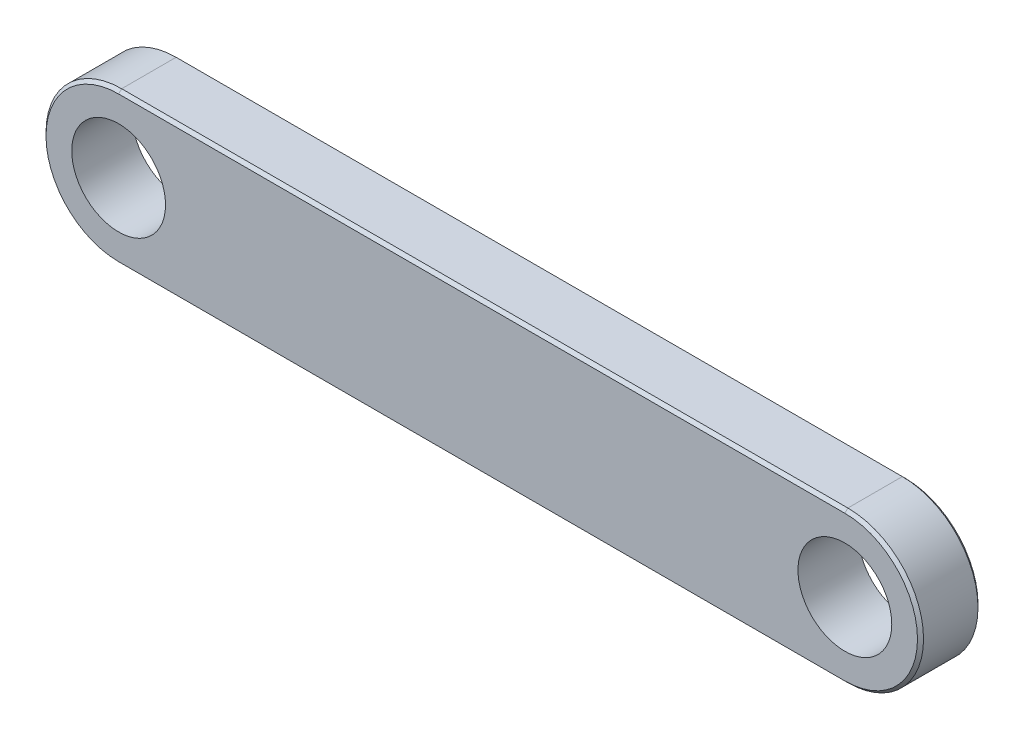
ISO-10303-21;
HEADER;
FILE_DESCRIPTION(('STEP AP214'),'2;1');
FILE_NAME('part.step','',(''),(''),'','','');
FILE_SCHEMA(('AUTOMOTIVE_DESIGN { 1 0 10303 214 1 1 1 1 }'));
ENDSEC;
DATA;
#1=APPLICATION_CONTEXT('core data for automotive mechanical design processes');
#2=APPLICATION_PROTOCOL_DEFINITION('international standard','automotive_design',2000,#1);
#3=PRODUCT_CONTEXT('',#1,'mechanical');
#4=PRODUCT('Part','Part','',(#3));
#5=PRODUCT_RELATED_PRODUCT_CATEGORY('part','',(#4));
#6=PRODUCT_DEFINITION_FORMATION('','',#4);
#7=PRODUCT_DEFINITION_CONTEXT('part definition',#1,'design');
#8=PRODUCT_DEFINITION('design','',#6,#7);
#9=PRODUCT_DEFINITION_SHAPE('','',#8);
#10=(LENGTH_UNIT() NAMED_UNIT(*) SI_UNIT(.MILLI.,.METRE.));
#11=(NAMED_UNIT(*) PLANE_ANGLE_UNIT() SI_UNIT($,.RADIAN.));
#12=(NAMED_UNIT(*) SI_UNIT($,.STERADIAN.) SOLID_ANGLE_UNIT());
#13=UNCERTAINTY_MEASURE_WITH_UNIT(LENGTH_MEASURE(1.E-05),#10,'distance_accuracy_value','');
#14=(GEOMETRIC_REPRESENTATION_CONTEXT(3) GLOBAL_UNCERTAINTY_ASSIGNED_CONTEXT((#13)) GLOBAL_UNIT_ASSIGNED_CONTEXT((#10,
#11,#12)) REPRESENTATION_CONTEXT('',''));
#15=CARTESIAN_POINT('',(0.,0.,0.));
#16=DIRECTION('',(0.,0.,1.));
#17=DIRECTION('',(1.,0.,0.));
#18=AXIS2_PLACEMENT_3D('',#15,#16,#17);
#19=CARTESIAN_POINT('',(-11.9297449390968,0.,2.));
#20=DIRECTION('',(0.,0.,1.));
#21=DIRECTION('',(1.,0.,0.));
#22=AXIS2_PLACEMENT_3D('',#19,#20,#21);
#23=PLANE('',#22);
#24=CARTESIAN_POINT('',(-11.9297449390968,0.,2.));
#25=DIRECTION('',(0.,0.,1.));
#26=DIRECTION('',(1.,0.,0.));
#27=AXIS2_PLACEMENT_3D('',#24,#25,#26);
#28=CIRCLE('',#27,2.4);
#29=CARTESIAN_POINT('',(-11.9297449390968,2.4,2.));
#30=VERTEX_POINT('',#29);
#31=CARTESIAN_POINT('',(-11.9297449390968,-2.4,2.));
#32=VERTEX_POINT('',#31);
#33=EDGE_CURVE('E60',#30,#32,#28,.T.);
#34=ORIENTED_EDGE('',*,*,#33,.T.);
#35=DIRECTION('',(1.,0.,0.));
#36=VECTOR('',#35,1.);
#37=CARTESIAN_POINT('',(12.0702550609032,-2.4,2.));
#38=LINE('',#37,#36);
#39=CARTESIAN_POINT('',(12.0702550609032,-2.4,2.));
#40=VERTEX_POINT('',#39);
#41=EDGE_CURVE('E11',#32,#40,#38,.T.);
#42=ORIENTED_EDGE('',*,*,#41,.T.);
#43=CARTESIAN_POINT('',(12.0702550609032,0.,2.));
#44=DIRECTION('',(0.,0.,1.));
#45=DIRECTION('',(1.,0.,0.));
#46=AXIS2_PLACEMENT_3D('',#43,#44,#45);
#47=CIRCLE('',#46,2.4);
#48=CARTESIAN_POINT('',(12.0702550609032,2.4,2.));
#49=VERTEX_POINT('',#48);
#50=EDGE_CURVE('E45',#40,#49,#47,.T.);
#51=ORIENTED_EDGE('',*,*,#50,.T.);
#52=DIRECTION('',(-1.,0.,0.));
#53=VECTOR('',#52,1.);
#54=CARTESIAN_POINT('',(-11.9297449390968,2.4,2.));
#55=LINE('',#54,#53);
#56=EDGE_CURVE('E200',#49,#30,#55,.T.);
#57=ORIENTED_EDGE('',*,*,#56,.T.);
#58=EDGE_LOOP('',(#34,#42,#51,#57));
#59=FACE_BOUND('',#58,.T.);
#60=CARTESIAN_POINT('',(12.0702550609032,0.,2.));
#61=DIRECTION('',(0.,0.,1.));
#62=DIRECTION('',(1.,0.,0.));
#63=AXIS2_PLACEMENT_3D('',#60,#61,#62);
#64=CIRCLE('',#63,1.55);
#65=CARTESIAN_POINT('',(13.6202550609032,0.,2.));
#66=VERTEX_POINT('',#65);
#67=EDGE_CURVE('E172',#66,#66,#64,.T.);
#68=ORIENTED_EDGE('',*,*,#67,.F.);
#69=EDGE_LOOP('',(#68));
#70=FACE_BOUND('',#69,.T.);
#71=CARTESIAN_POINT('',(-11.9297449390968,0.,2.));
#72=DIRECTION('',(0.,0.,1.));
#73=DIRECTION('',(1.,0.,0.));
#74=AXIS2_PLACEMENT_3D('',#71,#72,#73);
#75=CIRCLE('',#74,1.55);
#76=CARTESIAN_POINT('',(-10.3797449390968,0.,2.));
#77=VERTEX_POINT('',#76);
#78=EDGE_CURVE('E164',#77,#77,#75,.T.);
#79=ORIENTED_EDGE('',*,*,#78,.F.);
#80=EDGE_LOOP('',(#79));
#81=FACE_BOUND('',#80,.T.);
#82=ADVANCED_FACE('F35',(#59,#70,#81),#23,.T.);
#83=CARTESIAN_POINT('',(-11.9297449390968,0.,0.));
#84=DIRECTION('',(0.,0.,1.));
#85=DIRECTION('',(1.,0.,0.));
#86=AXIS2_PLACEMENT_3D('',#83,#84,#85);
#87=PLANE('',#86);
#88=CARTESIAN_POINT('',(12.0702550609032,0.,0.));
#89=DIRECTION('',(0.,0.,1.));
#90=DIRECTION('',(1.,0.,0.));
#91=AXIS2_PLACEMENT_3D('',#88,#89,#90);
#92=CIRCLE('',#91,2.4);
#93=CARTESIAN_POINT('',(12.0702550609032,2.4,0.));
#94=VERTEX_POINT('',#93);
#95=CARTESIAN_POINT('',(12.0702550609032,-2.4,0.));
#96=VERTEX_POINT('',#95);
#97=EDGE_CURVE('E187',#94,#96,#92,.F.);
#98=ORIENTED_EDGE('',*,*,#97,.T.);
#99=DIRECTION('',(-1.,0.,0.));
#100=VECTOR('',#99,1.);
#101=CARTESIAN_POINT('',(-11.9297449390968,-2.4,0.));
#102=LINE('',#101,#100);
#103=CARTESIAN_POINT('',(-11.9297449390968,-2.4,0.));
#104=VERTEX_POINT('',#103);
#105=EDGE_CURVE('E116',#96,#104,#102,.T.);
#106=ORIENTED_EDGE('',*,*,#105,.T.);
#107=CARTESIAN_POINT('',(-11.9297449390968,0.,0.));
#108=DIRECTION('',(0.,0.,1.));
#109=DIRECTION('',(1.,0.,0.));
#110=AXIS2_PLACEMENT_3D('',#107,#108,#109);
#111=CIRCLE('',#110,2.4);
#112=CARTESIAN_POINT('',(-11.9297449390968,2.4,0.));
#113=VERTEX_POINT('',#112);
#114=EDGE_CURVE('E185',#104,#113,#111,.F.);
#115=ORIENTED_EDGE('',*,*,#114,.T.);
#116=DIRECTION('',(1.,0.,0.));
#117=VECTOR('',#116,1.);
#118=CARTESIAN_POINT('',(-11.9297449390968,2.4,0.));
#119=LINE('',#118,#117);
#120=EDGE_CURVE('E183',#113,#94,#119,.T.);
#121=ORIENTED_EDGE('',*,*,#120,.T.);
#122=EDGE_LOOP('',(#98,#106,#115,#121));
#123=FACE_BOUND('',#122,.T.);
#124=CARTESIAN_POINT('',(12.0702550609032,0.,0.));
#125=DIRECTION('',(0.,0.,1.));
#126=DIRECTION('',(1.,0.,0.));
#127=AXIS2_PLACEMENT_3D('',#124,#125,#126);
#128=CIRCLE('',#127,1.55);
#129=CARTESIAN_POINT('',(13.6202550609032,0.,0.));
#130=VERTEX_POINT('',#129);
#131=EDGE_CURVE('E169',#130,#130,#128,.T.);
#132=ORIENTED_EDGE('',*,*,#131,.T.);
#133=EDGE_LOOP('',(#132));
#134=FACE_BOUND('',#133,.T.);
#135=CARTESIAN_POINT('',(-11.9297449390968,0.,0.));
#136=DIRECTION('',(0.,0.,1.));
#137=DIRECTION('',(1.,0.,0.));
#138=AXIS2_PLACEMENT_3D('',#135,#136,#137);
#139=CIRCLE('',#138,1.55);
#140=CARTESIAN_POINT('',(-10.3797449390968,0.,0.));
#141=VERTEX_POINT('',#140);
#142=EDGE_CURVE('E158',#141,#141,#139,.T.);
#143=ORIENTED_EDGE('',*,*,#142,.T.);
#144=EDGE_LOOP('',(#143));
#145=FACE_BOUND('',#144,.T.);
#146=ADVANCED_FACE('F230',(#123,#134,#145),#87,.F.);
#147=CARTESIAN_POINT('',(-11.9297449390968,0.,2.));
#148=DIRECTION('',(0.,0.,-1.));
#149=DIRECTION('',(-1.,0.,0.));
#150=AXIS2_PLACEMENT_3D('',#147,#148,#149);
#151=CYLINDRICAL_SURFACE('',#150,2.5);
#152=DIRECTION('',(0.,0.,-1.));
#153=VECTOR('',#152,1.);
#154=CARTESIAN_POINT('',(-11.9297449390968,2.5,2.));
#155=LINE('',#154,#153);
#156=CARTESIAN_POINT('',(-11.9297449390968,2.5,1.9));
#157=VERTEX_POINT('',#156);
#158=CARTESIAN_POINT('',(-11.9297449390968,2.5,0.0999999999999994));
#159=VERTEX_POINT('',#158);
#160=EDGE_CURVE('E175',#157,#159,#155,.T.);
#161=ORIENTED_EDGE('',*,*,#160,.T.);
#162=CARTESIAN_POINT('',(-11.9297449390968,0.,0.0999999999999994));
#163=DIRECTION('',(0.,0.,1.));
#164=DIRECTION('',(1.,0.,0.));
#165=AXIS2_PLACEMENT_3D('',#162,#163,#164);
#166=CIRCLE('',#165,2.5);
#167=CARTESIAN_POINT('',(-11.9297449390968,-2.5,0.0999999999999994));
#168=VERTEX_POINT('',#167);
#169=EDGE_CURVE('E194',#159,#168,#166,.T.);
#170=ORIENTED_EDGE('',*,*,#169,.T.);
#171=DIRECTION('',(0.,0.,-1.));
#172=VECTOR('',#171,1.);
#173=CARTESIAN_POINT('',(-11.9297449390968,-2.5,2.));
#174=LINE('',#173,#172);
#175=CARTESIAN_POINT('',(-11.9297449390968,-2.5,1.9));
#176=VERTEX_POINT('',#175);
#177=EDGE_CURVE('E127',#176,#168,#174,.T.);
#178=ORIENTED_EDGE('',*,*,#177,.F.);
#179=CARTESIAN_POINT('',(-11.9297449390968,0.,1.9));
#180=DIRECTION('',(0.,0.,1.));
#181=DIRECTION('',(1.,0.,0.));
#182=AXIS2_PLACEMENT_3D('',#179,#180,#181);
#183=CIRCLE('',#182,2.5);
#184=EDGE_CURVE('E192',#176,#157,#183,.F.);
#185=ORIENTED_EDGE('',*,*,#184,.T.);
#186=EDGE_LOOP('',(#161,#170,#178,#185));
#187=FACE_BOUND('',#186,.T.);
#188=ADVANCED_FACE('F209',(#187),#151,.T.);
#189=CARTESIAN_POINT('',(-11.9297449390968,-2.5,2.));
#190=DIRECTION('',(0.,1.,0.));
#191=DIRECTION('',(0.,0.,1.));
#192=AXIS2_PLACEMENT_3D('',#189,#190,#191);
#193=PLANE('',#192);
#194=ORIENTED_EDGE('',*,*,#177,.T.);
#195=DIRECTION('',(1.,0.,0.));
#196=VECTOR('',#195,1.);
#197=CARTESIAN_POINT('',(-11.9297449390968,-2.5,0.0999999999999994));
#198=LINE('',#197,#196);
#199=CARTESIAN_POINT('',(12.0702550609032,-2.5,0.0999999999999994));
#200=VERTEX_POINT('',#199);
#201=EDGE_CURVE('E126',#168,#200,#198,.T.);
#202=ORIENTED_EDGE('',*,*,#201,.T.);
#203=DIRECTION('',(0.,0.,-1.));
#204=VECTOR('',#203,1.);
#205=CARTESIAN_POINT('',(12.0702550609032,-2.5,2.));
#206=LINE('',#205,#204);
#207=CARTESIAN_POINT('',(12.0702550609032,-2.5,1.9));
#208=VERTEX_POINT('',#207);
#209=EDGE_CURVE('E109',#208,#200,#206,.T.);
#210=ORIENTED_EDGE('',*,*,#209,.F.);
#211=DIRECTION('',(-1.,0.,0.));
#212=VECTOR('',#211,1.);
#213=CARTESIAN_POINT('',(-11.9297449390968,-2.5,1.9));
#214=LINE('',#213,#212);
#215=EDGE_CURVE('E123',#208,#176,#214,.T.);
#216=ORIENTED_EDGE('',*,*,#215,.T.);
#217=EDGE_LOOP('',(#194,#202,#210,#216));
#218=FACE_BOUND('',#217,.T.);
#219=ADVANCED_FACE('F122',(#218),#193,.F.);
#220=CARTESIAN_POINT('',(12.0702550609032,0.,2.));
#221=DIRECTION('',(0.,0.,-1.));
#222=DIRECTION('',(-1.,0.,0.));
#223=AXIS2_PLACEMENT_3D('',#220,#221,#222);
#224=CYLINDRICAL_SURFACE('',#223,2.5);
#225=ORIENTED_EDGE('',*,*,#209,.T.);
#226=CARTESIAN_POINT('',(12.0702550609032,0.,0.0999999999999994));
#227=DIRECTION('',(0.,0.,1.));
#228=DIRECTION('',(1.,0.,0.));
#229=AXIS2_PLACEMENT_3D('',#226,#227,#228);
#230=CIRCLE('',#229,2.5);
#231=CARTESIAN_POINT('',(12.0702550609032,2.5,0.0999999999999994));
#232=VERTEX_POINT('',#231);
#233=EDGE_CURVE('E115',#200,#232,#230,.T.);
#234=ORIENTED_EDGE('',*,*,#233,.T.);
#235=DIRECTION('',(0.,0.,-1.));
#236=VECTOR('',#235,1.);
#237=CARTESIAN_POINT('',(12.0702550609032,2.5,2.));
#238=LINE('',#237,#236);
#239=CARTESIAN_POINT('',(12.0702550609032,2.5,1.9));
#240=VERTEX_POINT('',#239);
#241=EDGE_CURVE('E111',#240,#232,#238,.T.);
#242=ORIENTED_EDGE('',*,*,#241,.F.);
#243=CARTESIAN_POINT('',(12.0702550609032,0.,1.9));
#244=DIRECTION('',(0.,0.,1.));
#245=DIRECTION('',(1.,0.,0.));
#246=AXIS2_PLACEMENT_3D('',#243,#244,#245);
#247=CIRCLE('',#246,2.5);
#248=EDGE_CURVE('E106',#240,#208,#247,.F.);
#249=ORIENTED_EDGE('',*,*,#248,.T.);
#250=EDGE_LOOP('',(#225,#234,#242,#249));
#251=FACE_BOUND('',#250,.T.);
#252=ADVANCED_FACE('F108',(#251),#224,.T.);
#253=CARTESIAN_POINT('',(-11.9297449390968,2.5,2.));
#254=DIRECTION('',(0.,-1.,0.));
#255=DIRECTION('',(0.,0.,-1.));
#256=AXIS2_PLACEMENT_3D('',#253,#254,#255);
#257=PLANE('',#256);
#258=ORIENTED_EDGE('',*,*,#241,.T.);
#259=DIRECTION('',(-1.,0.,0.));
#260=VECTOR('',#259,1.);
#261=CARTESIAN_POINT('',(-11.9297449390968,2.5,0.0999999999999994));
#262=LINE('',#261,#260);
#263=EDGE_CURVE('E198',#232,#159,#262,.T.);
#264=ORIENTED_EDGE('',*,*,#263,.T.);
#265=ORIENTED_EDGE('',*,*,#160,.F.);
#266=DIRECTION('',(1.,0.,0.));
#267=VECTOR('',#266,1.);
#268=CARTESIAN_POINT('',(12.0702550609032,2.5,1.9));
#269=LINE('',#268,#267);
#270=EDGE_CURVE('E196',#157,#240,#269,.T.);
#271=ORIENTED_EDGE('',*,*,#270,.T.);
#272=EDGE_LOOP('',(#258,#264,#265,#271));
#273=FACE_BOUND('',#272,.T.);
#274=ADVANCED_FACE('F211',(#273),#257,.F.);
#275=CARTESIAN_POINT('',(12.0702550609032,0.,2.));
#276=DIRECTION('',(0.,0.,-1.));
#277=DIRECTION('',(-1.,0.,0.));
#278=AXIS2_PLACEMENT_3D('',#275,#276,#277);
#279=CYLINDRICAL_SURFACE('',#278,1.55);
#280=ORIENTED_EDGE('',*,*,#67,.T.);
#281=EDGE_LOOP('',(#280));
#282=FACE_BOUND('',#281,.T.);
#283=ORIENTED_EDGE('',*,*,#131,.F.);
#284=EDGE_LOOP('',(#283));
#285=FACE_BOUND('',#284,.T.);
#286=ADVANCED_FACE('F238',(#282,#285),#279,.F.);
#287=CARTESIAN_POINT('',(-11.9297449390968,0.,2.));
#288=DIRECTION('',(0.,0.,-1.));
#289=DIRECTION('',(-1.,0.,0.));
#290=AXIS2_PLACEMENT_3D('',#287,#288,#289);
#291=CYLINDRICAL_SURFACE('',#290,1.55);
#292=ORIENTED_EDGE('',*,*,#78,.T.);
#293=EDGE_LOOP('',(#292));
#294=FACE_BOUND('',#293,.T.);
#295=ORIENTED_EDGE('',*,*,#142,.F.);
#296=EDGE_LOOP('',(#295));
#297=FACE_BOUND('',#296,.T.);
#298=ADVANCED_FACE('F270',(#294,#297),#291,.F.);
#299=CARTESIAN_POINT('',(-11.9297449390968,2.5,0.0999999999999994));
#300=DIRECTION('',(0.,-0.707106781186548,0.707106781186548));
#301=DIRECTION('',(-1.,0.,0.));
#302=AXIS2_PLACEMENT_3D('',#299,#300,#301);
#303=PLANE('',#302);
#304=DIRECTION('',(0.,0.707106781186548,0.707106781186548));
#305=VECTOR('',#304,1.);
#306=CARTESIAN_POINT('',(12.0702550609032,2.4,0.));
#307=LINE('',#306,#305);
#308=EDGE_CURVE('E150',#94,#232,#307,.T.);
#309=ORIENTED_EDGE('',*,*,#308,.F.);
#310=ORIENTED_EDGE('',*,*,#120,.F.);
#311=DIRECTION('',(0.,-0.707106781186548,-0.707106781186548));
#312=VECTOR('',#311,1.);
#313=CARTESIAN_POINT('',(-11.9297449390968,2.5,0.0999999999999994));
#314=LINE('',#313,#312);
#315=EDGE_CURVE('E138',#159,#113,#314,.T.);
#316=ORIENTED_EDGE('',*,*,#315,.F.);
#317=ORIENTED_EDGE('',*,*,#263,.F.);
#318=EDGE_LOOP('',(#309,#310,#316,#317));
#319=FACE_BOUND('',#318,.T.);
#320=ADVANCED_FACE('F214',(#319),#303,.F.);
#321=CARTESIAN_POINT('',(-11.9297449390968,0.,0.0999999999999994));
#322=DIRECTION('',(0.,0.,1.));
#323=DIRECTION('',(1.,0.,0.));
#324=AXIS2_PLACEMENT_3D('',#321,#322,#323);
#325=CONICAL_SURFACE('',#324,2.5,0.785398163397448);
#326=ORIENTED_EDGE('',*,*,#315,.T.);
#327=ORIENTED_EDGE('',*,*,#114,.F.);
#328=DIRECTION('',(0.,0.707106781186548,-0.707106781186548));
#329=VECTOR('',#328,1.);
#330=CARTESIAN_POINT('',(-11.9297449390968,-2.5,0.0999999999999994));
#331=LINE('',#330,#329);
#332=EDGE_CURVE('E144',#168,#104,#331,.T.);
#333=ORIENTED_EDGE('',*,*,#332,.F.);
#334=ORIENTED_EDGE('',*,*,#169,.F.);
#335=EDGE_LOOP('',(#326,#327,#333,#334));
#336=FACE_BOUND('',#335,.T.);
#337=ADVANCED_FACE('F217',(#336),#325,.T.);
#338=CARTESIAN_POINT('',(12.0702550609032,0.,0.0999999999999994));
#339=DIRECTION('',(0.,0.,1.));
#340=DIRECTION('',(1.,0.,0.));
#341=AXIS2_PLACEMENT_3D('',#338,#339,#340);
#342=CONICAL_SURFACE('',#341,2.5,0.785398163397448);
#343=ORIENTED_EDGE('',*,*,#308,.T.);
#344=ORIENTED_EDGE('',*,*,#233,.F.);
#345=DIRECTION('',(0.,-0.707106781186548,0.707106781186548));
#346=VECTOR('',#345,1.);
#347=CARTESIAN_POINT('',(12.0702550609032,-2.4,0.));
#348=LINE('',#347,#346);
#349=EDGE_CURVE('E141',#96,#200,#348,.T.);
#350=ORIENTED_EDGE('',*,*,#349,.F.);
#351=ORIENTED_EDGE('',*,*,#97,.F.);
#352=EDGE_LOOP('',(#343,#344,#350,#351));
#353=FACE_BOUND('',#352,.T.);
#354=ADVANCED_FACE('F220',(#353),#342,.T.);
#355=CARTESIAN_POINT('',(-11.9297449390968,-2.5,0.0999999999999994));
#356=DIRECTION('',(0.,0.707106781186548,0.707106781186548));
#357=DIRECTION('',(1.,0.,0.));
#358=AXIS2_PLACEMENT_3D('',#355,#356,#357);
#359=PLANE('',#358);
#360=ORIENTED_EDGE('',*,*,#332,.T.);
#361=ORIENTED_EDGE('',*,*,#105,.F.);
#362=ORIENTED_EDGE('',*,*,#349,.T.);
#363=ORIENTED_EDGE('',*,*,#201,.F.);
#364=EDGE_LOOP('',(#360,#361,#362,#363));
#365=FACE_BOUND('',#364,.T.);
#366=ADVANCED_FACE('F218',(#365),#359,.F.);
#367=CARTESIAN_POINT('',(-11.9297449390968,2.4,2.));
#368=DIRECTION('',(0.,0.707106781186548,0.707106781186548));
#369=DIRECTION('',(1.,0.,0.));
#370=AXIS2_PLACEMENT_3D('',#367,#368,#369);
#371=PLANE('',#370);
#372=DIRECTION('',(0.,-0.707106781186548,0.707106781186548));
#373=VECTOR('',#372,1.);
#374=CARTESIAN_POINT('',(12.0702550609032,2.5,1.9));
#375=LINE('',#374,#373);
#376=EDGE_CURVE('E135',#240,#49,#375,.T.);
#377=ORIENTED_EDGE('',*,*,#376,.F.);
#378=ORIENTED_EDGE('',*,*,#270,.F.);
#379=DIRECTION('',(0.,0.707106781186548,-0.707106781186548));
#380=VECTOR('',#379,1.);
#381=CARTESIAN_POINT('',(-11.9297449390968,2.4,2.));
#382=LINE('',#381,#380);
#383=EDGE_CURVE('E40',#30,#157,#382,.T.);
#384=ORIENTED_EDGE('',*,*,#383,.F.);
#385=ORIENTED_EDGE('',*,*,#56,.F.);
#386=EDGE_LOOP('',(#377,#378,#384,#385));
#387=FACE_BOUND('',#386,.T.);
#388=ADVANCED_FACE('F38',(#387),#371,.T.);
#389=CARTESIAN_POINT('',(-11.9297449390968,0.,2.));
#390=DIRECTION('',(0.,0.,-1.));
#391=DIRECTION('',(-1.,0.,0.));
#392=AXIS2_PLACEMENT_3D('',#389,#390,#391);
#393=CONICAL_SURFACE('',#392,2.4,0.785398163397448);
#394=ORIENTED_EDGE('',*,*,#383,.T.);
#395=ORIENTED_EDGE('',*,*,#184,.F.);
#396=DIRECTION('',(0.,-0.707106781186548,-0.707106781186548));
#397=VECTOR('',#396,1.);
#398=CARTESIAN_POINT('',(-11.9297449390968,-2.4,2.));
#399=LINE('',#398,#397);
#400=EDGE_CURVE('E130',#32,#176,#399,.T.);
#401=ORIENTED_EDGE('',*,*,#400,.F.);
#402=ORIENTED_EDGE('',*,*,#33,.F.);
#403=EDGE_LOOP('',(#394,#395,#401,#402));
#404=FACE_BOUND('',#403,.T.);
#405=ADVANCED_FACE('F206',(#404),#393,.T.);
#406=CARTESIAN_POINT('',(12.0702550609032,0.,2.));
#407=DIRECTION('',(0.,0.,-1.));
#408=DIRECTION('',(-1.,0.,0.));
#409=AXIS2_PLACEMENT_3D('',#406,#407,#408);
#410=CONICAL_SURFACE('',#409,2.4,0.785398163397448);
#411=ORIENTED_EDGE('',*,*,#376,.T.);
#412=ORIENTED_EDGE('',*,*,#50,.F.);
#413=DIRECTION('',(0.,0.707106781186548,0.707106781186548));
#414=VECTOR('',#413,1.);
#415=CARTESIAN_POINT('',(12.0702550609032,-2.5,1.9));
#416=LINE('',#415,#414);
#417=EDGE_CURVE('E53',#208,#40,#416,.T.);
#418=ORIENTED_EDGE('',*,*,#417,.F.);
#419=ORIENTED_EDGE('',*,*,#248,.F.);
#420=EDGE_LOOP('',(#411,#412,#418,#419));
#421=FACE_BOUND('',#420,.T.);
#422=ADVANCED_FACE('F133',(#421),#410,.T.);
#423=CARTESIAN_POINT('',(-11.9297449390968,-2.4,2.));
#424=DIRECTION('',(0.,-0.707106781186548,0.707106781186548));
#425=DIRECTION('',(-1.,0.,0.));
#426=AXIS2_PLACEMENT_3D('',#423,#424,#425);
#427=PLANE('',#426);
#428=ORIENTED_EDGE('',*,*,#400,.T.);
#429=ORIENTED_EDGE('',*,*,#215,.F.);
#430=ORIENTED_EDGE('',*,*,#417,.T.);
#431=ORIENTED_EDGE('',*,*,#41,.F.);
#432=EDGE_LOOP('',(#428,#429,#430,#431));
#433=FACE_BOUND('',#432,.T.);
#434=ADVANCED_FACE('F129',(#433),#427,.T.);
#435=CLOSED_SHELL('',(#82,#146,#188,#219,#252,#274,#286,#298,#320,#337,#354,#366,#388,#405,#422,#434));
#436=MANIFOLD_SOLID_BREP('B2',#435);
#437=ADVANCED_BREP_SHAPE_REPRESENTATION('',(#18,#436),#14);
#438=SHAPE_DEFINITION_REPRESENTATION(#9,#437);
ENDSEC;
END-ISO-10303-21;
